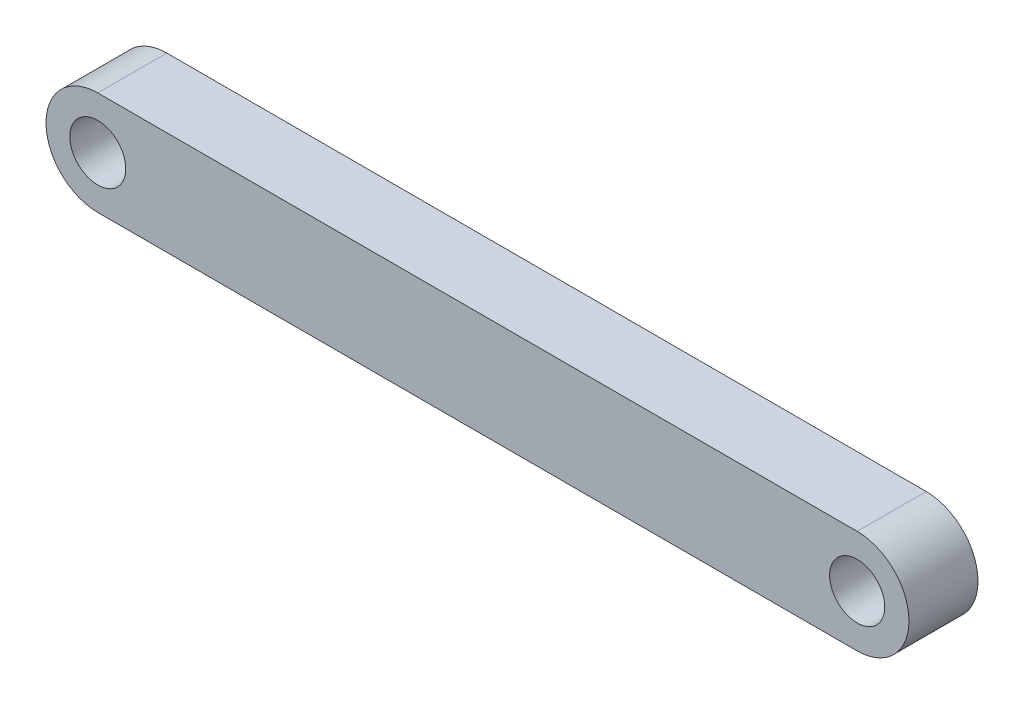
ISO-10303-21;
HEADER;
FILE_DESCRIPTION(('STEP AP214'),'2;1');
FILE_NAME('part.step','',(''),(''),'','','');
FILE_SCHEMA(('AUTOMOTIVE_DESIGN { 1 0 10303 214 1 1 1 1 }'));
ENDSEC;
DATA;
#1=APPLICATION_CONTEXT('core data for automotive mechanical design processes');
#2=APPLICATION_PROTOCOL_DEFINITION('international standard','automotive_design',2000,#1);
#3=PRODUCT_CONTEXT('',#1,'mechanical');
#4=PRODUCT('Part','Part','',(#3));
#5=PRODUCT_RELATED_PRODUCT_CATEGORY('part','',(#4));
#6=PRODUCT_DEFINITION_FORMATION('','',#4);
#7=PRODUCT_DEFINITION_CONTEXT('part definition',#1,'design');
#8=PRODUCT_DEFINITION('design','',#6,#7);
#9=PRODUCT_DEFINITION_SHAPE('','',#8);
#10=(LENGTH_UNIT() NAMED_UNIT(*) SI_UNIT(.MILLI.,.METRE.));
#11=(NAMED_UNIT(*) PLANE_ANGLE_UNIT() SI_UNIT($,.RADIAN.));
#12=(NAMED_UNIT(*) SI_UNIT($,.STERADIAN.) SOLID_ANGLE_UNIT());
#13=UNCERTAINTY_MEASURE_WITH_UNIT(LENGTH_MEASURE(1.E-05),#10,'distance_accuracy_value','');
#14=(GEOMETRIC_REPRESENTATION_CONTEXT(3) GLOBAL_UNCERTAINTY_ASSIGNED_CONTEXT((#13)) GLOBAL_UNIT_ASSIGNED_CONTEXT((#10,
#11,#12)) REPRESENTATION_CONTEXT('',''));
#15=CARTESIAN_POINT('',(0.,0.,0.));
#16=DIRECTION('',(0.,0.,1.));
#17=DIRECTION('',(1.,0.,0.));
#18=AXIS2_PLACEMENT_3D('',#15,#16,#17);
#19=CARTESIAN_POINT('',(-55.,0.,10.));
#20=DIRECTION('',(0.,0.,1.));
#21=DIRECTION('',(1.,0.,0.));
#22=AXIS2_PLACEMENT_3D('',#19,#20,#21);
#23=PLANE('',#22);
#24=CARTESIAN_POINT('',(-55.,0.,10.));
#25=DIRECTION('',(0.,0.,1.));
#26=DIRECTION('',(1.,0.,0.));
#27=AXIS2_PLACEMENT_3D('',#24,#25,#26);
#28=CIRCLE('',#27,4.05257442679971);
#29=CARTESIAN_POINT('',(-50.9474255732003,0.,10.));
#30=VERTEX_POINT('',#29);
#31=EDGE_CURVE('E100',#30,#30,#28,.T.);
#32=ORIENTED_EDGE('',*,*,#31,.F.);
#33=EDGE_LOOP('',(#32));
#34=FACE_BOUND('',#33,.T.);
#35=CARTESIAN_POINT('',(-55.,0.,10.));
#36=DIRECTION('',(0.,0.,1.));
#37=DIRECTION('',(1.,0.,0.));
#38=AXIS2_PLACEMENT_3D('',#35,#36,#37);
#39=CIRCLE('',#38,7.50000000000001);
#40=CARTESIAN_POINT('',(-55.,7.49999999999999,10.));
#41=VERTEX_POINT('',#40);
#42=CARTESIAN_POINT('',(-55.,-7.50000000000002,10.));
#43=VERTEX_POINT('',#42);
#44=EDGE_CURVE('E85',#41,#43,#39,.T.);
#45=ORIENTED_EDGE('',*,*,#44,.T.);
#46=DIRECTION('',(1.,0.,0.));
#47=VECTOR('',#46,1.);
#48=CARTESIAN_POINT('',(-55.,-7.50000000000002,10.));
#49=LINE('',#48,#47);
#50=CARTESIAN_POINT('',(55.,-7.50000000000001,10.));
#51=VERTEX_POINT('',#50);
#52=EDGE_CURVE('E80',#43,#51,#49,.T.);
#53=ORIENTED_EDGE('',*,*,#52,.T.);
#54=CARTESIAN_POINT('',(55.,0.,10.));
#55=DIRECTION('',(0.,0.,1.));
#56=DIRECTION('',(1.,0.,0.));
#57=AXIS2_PLACEMENT_3D('',#54,#55,#56);
#58=CIRCLE('',#57,7.50000000000001);
#59=CARTESIAN_POINT('',(55.,7.5,10.));
#60=VERTEX_POINT('',#59);
#61=EDGE_CURVE('E83',#51,#60,#58,.T.);
#62=ORIENTED_EDGE('',*,*,#61,.T.);
#63=DIRECTION('',(-1.,0.,0.));
#64=VECTOR('',#63,1.);
#65=CARTESIAN_POINT('',(-55.,7.49999999999999,10.));
#66=LINE('',#65,#64);
#67=EDGE_CURVE('E50',#60,#41,#66,.T.);
#68=ORIENTED_EDGE('',*,*,#67,.T.);
#69=EDGE_LOOP('',(#45,#53,#62,#68));
#70=FACE_BOUND('',#69,.T.);
#71=CARTESIAN_POINT('',(55.,0.,10.));
#72=DIRECTION('',(0.,0.,1.));
#73=DIRECTION('',(1.,0.,0.));
#74=AXIS2_PLACEMENT_3D('',#71,#72,#73);
#75=CIRCLE('',#74,3.9918885583426);
#76=CARTESIAN_POINT('',(58.9918885583426,0.,10.));
#77=VERTEX_POINT('',#76);
#78=EDGE_CURVE('E115',#77,#77,#75,.T.);
#79=ORIENTED_EDGE('',*,*,#78,.F.);
#80=EDGE_LOOP('',(#79));
#81=FACE_BOUND('',#80,.T.);
#82=ADVANCED_FACE('F33',(#34,#70,#81),#23,.T.);
#83=CARTESIAN_POINT('',(-55.,0.,0.));
#84=DIRECTION('',(0.,0.,1.));
#85=DIRECTION('',(1.,0.,0.));
#86=AXIS2_PLACEMENT_3D('',#83,#84,#85);
#87=PLANE('',#86);
#88=CARTESIAN_POINT('',(-55.,0.,0.));
#89=DIRECTION('',(0.,0.,1.));
#90=DIRECTION('',(1.,0.,0.));
#91=AXIS2_PLACEMENT_3D('',#88,#89,#90);
#92=CIRCLE('',#91,7.50000000000001);
#93=CARTESIAN_POINT('',(-55.,7.49999999999999,0.));
#94=VERTEX_POINT('',#93);
#95=CARTESIAN_POINT('',(-55.,-7.50000000000002,0.));
#96=VERTEX_POINT('',#95);
#97=EDGE_CURVE('E97',#94,#96,#92,.T.);
#98=ORIENTED_EDGE('',*,*,#97,.F.);
#99=DIRECTION('',(-1.,0.,0.));
#100=VECTOR('',#99,1.);
#101=CARTESIAN_POINT('',(-55.,7.49999999999999,0.));
#102=LINE('',#101,#100);
#103=CARTESIAN_POINT('',(55.,7.5,0.));
#104=VERTEX_POINT('',#103);
#105=EDGE_CURVE('E73',#104,#94,#102,.T.);
#106=ORIENTED_EDGE('',*,*,#105,.F.);
#107=CARTESIAN_POINT('',(55.,0.,0.));
#108=DIRECTION('',(0.,0.,1.));
#109=DIRECTION('',(1.,0.,0.));
#110=AXIS2_PLACEMENT_3D('',#107,#108,#109);
#111=CIRCLE('',#110,7.50000000000001);
#112=CARTESIAN_POINT('',(55.,-7.50000000000001,0.));
#113=VERTEX_POINT('',#112);
#114=EDGE_CURVE('E67',#113,#104,#111,.T.);
#115=ORIENTED_EDGE('',*,*,#114,.F.);
#116=DIRECTION('',(1.,0.,0.));
#117=VECTOR('',#116,1.);
#118=CARTESIAN_POINT('',(-55.,-7.50000000000002,0.));
#119=LINE('',#118,#117);
#120=EDGE_CURVE('E89',#96,#113,#119,.T.);
#121=ORIENTED_EDGE('',*,*,#120,.F.);
#122=EDGE_LOOP('',(#98,#106,#115,#121));
#123=FACE_BOUND('',#122,.T.);
#124=CARTESIAN_POINT('',(-55.,0.,0.));
#125=DIRECTION('',(0.,0.,1.));
#126=DIRECTION('',(1.,0.,0.));
#127=AXIS2_PLACEMENT_3D('',#124,#125,#126);
#128=CIRCLE('',#127,4.05257442679971);
#129=CARTESIAN_POINT('',(-50.9474255732003,0.,0.));
#130=VERTEX_POINT('',#129);
#131=EDGE_CURVE('E112',#130,#130,#128,.T.);
#132=ORIENTED_EDGE('',*,*,#131,.T.);
#133=EDGE_LOOP('',(#132));
#134=FACE_BOUND('',#133,.T.);
#135=CARTESIAN_POINT('',(55.,0.,0.));
#136=DIRECTION('',(0.,0.,1.));
#137=DIRECTION('',(1.,0.,0.));
#138=AXIS2_PLACEMENT_3D('',#135,#136,#137);
#139=CIRCLE('',#138,3.9918885583426);
#140=CARTESIAN_POINT('',(58.9918885583426,0.,0.));
#141=VERTEX_POINT('',#140);
#142=EDGE_CURVE('E118',#141,#141,#139,.T.);
#143=ORIENTED_EDGE('',*,*,#142,.T.);
#144=EDGE_LOOP('',(#143));
#145=FACE_BOUND('',#144,.T.);
#146=ADVANCED_FACE('F108',(#123,#134,#145),#87,.F.);
#147=CARTESIAN_POINT('',(-55.,0.,10.));
#148=DIRECTION('',(0.,0.,-1.));
#149=DIRECTION('',(-1.,0.,0.));
#150=AXIS2_PLACEMENT_3D('',#147,#148,#149);
#151=CYLINDRICAL_SURFACE('',#150,7.50000000000001);
#152=ORIENTED_EDGE('',*,*,#97,.T.);
#153=DIRECTION('',(0.,0.,-1.));
#154=VECTOR('',#153,1.);
#155=CARTESIAN_POINT('',(-55.,-7.50000000000002,10.));
#156=LINE('',#155,#154);
#157=EDGE_CURVE('E11',#43,#96,#156,.T.);
#158=ORIENTED_EDGE('',*,*,#157,.F.);
#159=ORIENTED_EDGE('',*,*,#44,.F.);
#160=DIRECTION('',(0.,0.,-1.));
#161=VECTOR('',#160,1.);
#162=CARTESIAN_POINT('',(-55.,7.49999999999999,10.));
#163=LINE('',#162,#161);
#164=EDGE_CURVE('E93',#41,#94,#163,.T.);
#165=ORIENTED_EDGE('',*,*,#164,.T.);
#166=EDGE_LOOP('',(#152,#158,#159,#165));
#167=FACE_BOUND('',#166,.T.);
#168=ADVANCED_FACE('F35',(#167),#151,.T.);
#169=CARTESIAN_POINT('',(-55.,-7.50000000000002,10.));
#170=DIRECTION('',(0.,1.,0.));
#171=DIRECTION('',(-1.,0.,0.));
#172=AXIS2_PLACEMENT_3D('',#169,#170,#171);
#173=PLANE('',#172);
#174=ORIENTED_EDGE('',*,*,#120,.T.);
#175=DIRECTION('',(0.,0.,-1.));
#176=VECTOR('',#175,1.);
#177=CARTESIAN_POINT('',(55.,-7.50000000000001,10.));
#178=LINE('',#177,#176);
#179=EDGE_CURVE('E42',#51,#113,#178,.T.);
#180=ORIENTED_EDGE('',*,*,#179,.F.);
#181=ORIENTED_EDGE('',*,*,#52,.F.);
#182=ORIENTED_EDGE('',*,*,#157,.T.);
#183=EDGE_LOOP('',(#174,#180,#181,#182));
#184=FACE_BOUND('',#183,.T.);
#185=ADVANCED_FACE('F88',(#184),#173,.F.);
#186=CARTESIAN_POINT('',(55.,0.,10.));
#187=DIRECTION('',(0.,0.,-1.));
#188=DIRECTION('',(-1.,0.,0.));
#189=AXIS2_PLACEMENT_3D('',#186,#187,#188);
#190=CYLINDRICAL_SURFACE('',#189,7.50000000000001);
#191=ORIENTED_EDGE('',*,*,#114,.T.);
#192=DIRECTION('',(0.,0.,-1.));
#193=VECTOR('',#192,1.);
#194=CARTESIAN_POINT('',(55.,7.5,10.));
#195=LINE('',#194,#193);
#196=EDGE_CURVE('E90',#60,#104,#195,.T.);
#197=ORIENTED_EDGE('',*,*,#196,.F.);
#198=ORIENTED_EDGE('',*,*,#61,.F.);
#199=ORIENTED_EDGE('',*,*,#179,.T.);
#200=EDGE_LOOP('',(#191,#197,#198,#199));
#201=FACE_BOUND('',#200,.T.);
#202=ADVANCED_FACE('F91',(#201),#190,.T.);
#203=CARTESIAN_POINT('',(-55.,7.49999999999999,10.));
#204=DIRECTION('',(0.,-1.,0.));
#205=DIRECTION('',(1.,0.,0.));
#206=AXIS2_PLACEMENT_3D('',#203,#204,#205);
#207=PLANE('',#206);
#208=ORIENTED_EDGE('',*,*,#105,.T.);
#209=ORIENTED_EDGE('',*,*,#164,.F.);
#210=ORIENTED_EDGE('',*,*,#67,.F.);
#211=ORIENTED_EDGE('',*,*,#196,.T.);
#212=EDGE_LOOP('',(#208,#209,#210,#211));
#213=FACE_BOUND('',#212,.T.);
#214=ADVANCED_FACE('F105',(#213),#207,.F.);
#215=CARTESIAN_POINT('',(-55.,0.,10.));
#216=DIRECTION('',(0.,0.,-1.));
#217=DIRECTION('',(-1.,0.,0.));
#218=AXIS2_PLACEMENT_3D('',#215,#216,#217);
#219=CYLINDRICAL_SURFACE('',#218,4.05257442679971);
#220=ORIENTED_EDGE('',*,*,#31,.T.);
#221=EDGE_LOOP('',(#220));
#222=FACE_BOUND('',#221,.T.);
#223=ORIENTED_EDGE('',*,*,#131,.F.);
#224=EDGE_LOOP('',(#223));
#225=FACE_BOUND('',#224,.T.);
#226=ADVANCED_FACE('F135',(#222,#225),#219,.F.);
#227=CARTESIAN_POINT('',(55.,0.,10.));
#228=DIRECTION('',(0.,0.,-1.));
#229=DIRECTION('',(-1.,0.,0.));
#230=AXIS2_PLACEMENT_3D('',#227,#228,#229);
#231=CYLINDRICAL_SURFACE('',#230,3.9918885583426);
#232=ORIENTED_EDGE('',*,*,#78,.T.);
#233=EDGE_LOOP('',(#232));
#234=FACE_BOUND('',#233,.T.);
#235=ORIENTED_EDGE('',*,*,#142,.F.);
#236=EDGE_LOOP('',(#235));
#237=FACE_BOUND('',#236,.T.);
#238=ADVANCED_FACE('F124',(#234,#237),#231,.F.);
#239=CLOSED_SHELL('',(#82,#146,#168,#185,#202,#214,#226,#238));
#240=MANIFOLD_SOLID_BREP('B2',#239);
#241=ADVANCED_BREP_SHAPE_REPRESENTATION('',(#18,#240),#14);
#242=SHAPE_DEFINITION_REPRESENTATION(#9,#241);
ENDSEC;
END-ISO-10303-21;
